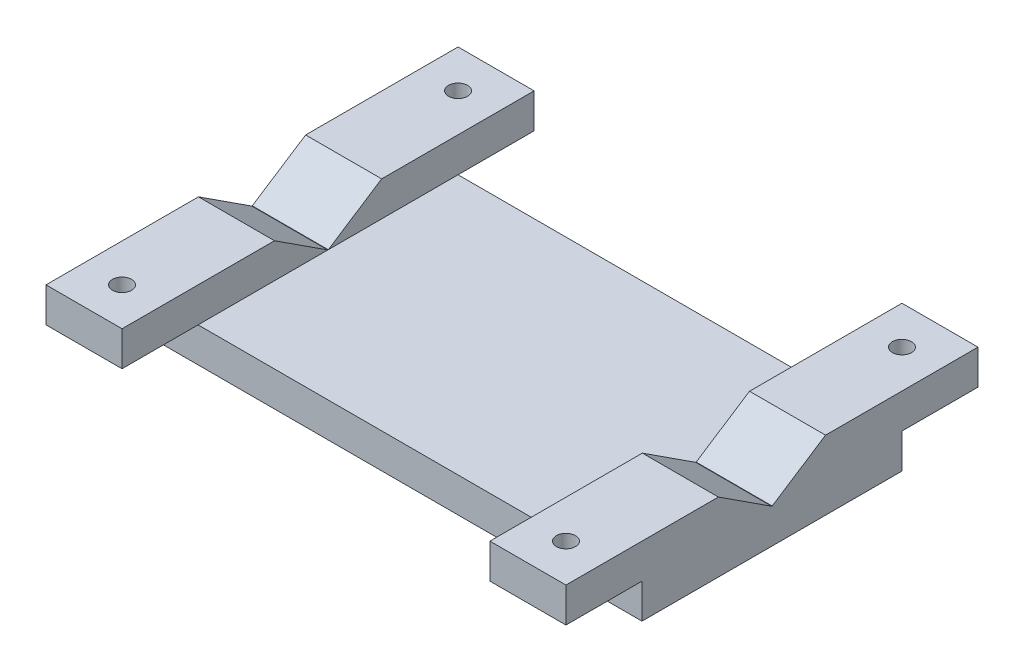
ISO-10303-21;
HEADER;
FILE_DESCRIPTION(('STEP AP214'),'2;1');
FILE_NAME('part.step','',(''),(''),'','','');
FILE_SCHEMA(('AUTOMOTIVE_DESIGN { 1 0 10303 214 1 1 1 1 }'));
ENDSEC;
DATA;
#1=APPLICATION_CONTEXT('core data for automotive mechanical design processes');
#2=APPLICATION_PROTOCOL_DEFINITION('international standard','automotive_design',2000,#1);
#3=PRODUCT_CONTEXT('',#1,'mechanical');
#4=PRODUCT('Part','Part','',(#3));
#5=PRODUCT_RELATED_PRODUCT_CATEGORY('part','',(#4));
#6=PRODUCT_DEFINITION_FORMATION('','',#4);
#7=PRODUCT_DEFINITION_CONTEXT('part definition',#1,'design');
#8=PRODUCT_DEFINITION('design','',#6,#7);
#9=PRODUCT_DEFINITION_SHAPE('','',#8);
#10=(LENGTH_UNIT() NAMED_UNIT(*) SI_UNIT(.MILLI.,.METRE.));
#11=(NAMED_UNIT(*) PLANE_ANGLE_UNIT() SI_UNIT($,.RADIAN.));
#12=(NAMED_UNIT(*) SI_UNIT($,.STERADIAN.) SOLID_ANGLE_UNIT());
#13=UNCERTAINTY_MEASURE_WITH_UNIT(LENGTH_MEASURE(1.E-05),#10,'distance_accuracy_value','');
#14=(GEOMETRIC_REPRESENTATION_CONTEXT(3) GLOBAL_UNCERTAINTY_ASSIGNED_CONTEXT((#13)) GLOBAL_UNIT_ASSIGNED_CONTEXT((#10,
#11,#12)) REPRESENTATION_CONTEXT('',''));
#15=CARTESIAN_POINT('',(0.,0.,0.));
#16=DIRECTION('',(0.,0.,1.));
#17=DIRECTION('',(1.,0.,0.));
#18=AXIS2_PLACEMENT_3D('',#15,#16,#17);
#19=CARTESIAN_POINT('',(0.,4.,0.));
#20=DIRECTION('',(0.,1.,0.));
#21=DIRECTION('',(0.,0.,1.));
#22=AXIS2_PLACEMENT_3D('',#19,#20,#21);
#23=PLANE('',#22);
#24=DIRECTION('',(0.,0.,-1.));
#25=VECTOR('',#24,1.);
#26=CARTESIAN_POINT('',(30.,4.,15.));
#27=LINE('',#26,#25);
#28=CARTESIAN_POINT('',(30.,4.,0.0247999999999568));
#29=VERTEX_POINT('',#28);
#30=CARTESIAN_POINT('',(30.,4.,-0.0247999999999568));
#31=VERTEX_POINT('',#30);
#32=EDGE_CURVE('E380',#29,#31,#27,.T.);
#33=ORIENTED_EDGE('',*,*,#32,.T.);
#34=DIRECTION('',(-1.,0.,0.));
#35=VECTOR('',#34,1.);
#36=CARTESIAN_POINT('',(0.,4.,-0.024799999999954));
#37=LINE('',#36,#35);
#38=CARTESIAN_POINT('',(21.2248,4.,-0.0247999999999568));
#39=VERTEX_POINT('',#38);
#40=EDGE_CURVE('E323',#31,#39,#37,.T.);
#41=ORIENTED_EDGE('',*,*,#40,.T.);
#42=DIRECTION('',(0.,0.,1.));
#43=VECTOR('',#42,1.);
#44=CARTESIAN_POINT('',(21.2248,4.,-23.7752));
#45=LINE('',#44,#43);
#46=CARTESIAN_POINT('',(21.2248,4.,-15.));
#47=VERTEX_POINT('',#46);
#48=EDGE_CURVE('E439',#47,#39,#45,.T.);
#49=ORIENTED_EDGE('',*,*,#48,.F.);
#50=DIRECTION('',(-1.,0.,0.));
#51=VECTOR('',#50,1.);
#52=CARTESIAN_POINT('',(30.,4.,-15.));
#53=LINE('',#52,#51);
#54=CARTESIAN_POINT('',(-21.2248,4.,-15.));
#55=VERTEX_POINT('',#54);
#56=EDGE_CURVE('E400',#47,#55,#53,.T.);
#57=ORIENTED_EDGE('',*,*,#56,.T.);
#58=DIRECTION('',(0.,0.,-1.));
#59=VECTOR('',#58,1.);
#60=CARTESIAN_POINT('',(-21.2248,4.,-23.7752));
#61=LINE('',#60,#59);
#62=CARTESIAN_POINT('',(-21.2248,4.,-0.0247999999999628));
#63=VERTEX_POINT('',#62);
#64=EDGE_CURVE('E292',#63,#55,#61,.T.);
#65=ORIENTED_EDGE('',*,*,#64,.F.);
#66=DIRECTION('',(-1.,0.,0.));
#67=VECTOR('',#66,1.);
#68=CARTESIAN_POINT('',(0.,4.,-0.0247999999999607));
#69=LINE('',#68,#67);
#70=CARTESIAN_POINT('',(-30.,4.,-0.0247999999999637));
#71=VERTEX_POINT('',#70);
#72=EDGE_CURVE('E314',#63,#71,#69,.T.);
#73=ORIENTED_EDGE('',*,*,#72,.T.);
#74=DIRECTION('',(0.,0.,1.));
#75=VECTOR('',#74,1.);
#76=CARTESIAN_POINT('',(-30.,4.,15.));
#77=LINE('',#76,#75);
#78=CARTESIAN_POINT('',(-30.,4.,0.0247999999999568));
#79=VERTEX_POINT('',#78);
#80=EDGE_CURVE('E306',#71,#79,#77,.T.);
#81=ORIENTED_EDGE('',*,*,#80,.T.);
#82=DIRECTION('',(1.,0.,0.));
#83=VECTOR('',#82,1.);
#84=CARTESIAN_POINT('',(0.,4.,0.0247999999999546));
#85=LINE('',#84,#83);
#86=CARTESIAN_POINT('',(-21.2248,4.,0.0247999999999567));
#87=VERTEX_POINT('',#86);
#88=EDGE_CURVE('E317',#79,#87,#85,.T.);
#89=ORIENTED_EDGE('',*,*,#88,.T.);
#90=DIRECTION('',(0.,0.,1.));
#91=VECTOR('',#90,1.);
#92=CARTESIAN_POINT('',(-21.2248,4.,0.));
#93=LINE('',#92,#91);
#94=CARTESIAN_POINT('',(-21.2248,4.,15.));
#95=VERTEX_POINT('',#94);
#96=EDGE_CURVE('E312',#87,#95,#93,.T.);
#97=ORIENTED_EDGE('',*,*,#96,.T.);
#98=DIRECTION('',(1.,0.,0.));
#99=VECTOR('',#98,1.);
#100=CARTESIAN_POINT('',(30.,4.,15.));
#101=LINE('',#100,#99);
#102=CARTESIAN_POINT('',(21.2248,4.,15.));
#103=VERTEX_POINT('',#102);
#104=EDGE_CURVE('E310',#95,#103,#101,.T.);
#105=ORIENTED_EDGE('',*,*,#104,.T.);
#106=DIRECTION('',(0.,0.,1.));
#107=VECTOR('',#106,1.);
#108=CARTESIAN_POINT('',(21.2248,4.,23.7752));
#109=LINE('',#108,#107);
#110=CARTESIAN_POINT('',(21.2248,4.,0.0247999999999561));
#111=VERTEX_POINT('',#110);
#112=EDGE_CURVE('E236',#111,#103,#109,.T.);
#113=ORIENTED_EDGE('',*,*,#112,.F.);
#114=DIRECTION('',(1.,0.,0.));
#115=VECTOR('',#114,1.);
#116=CARTESIAN_POINT('',(0.,4.,0.024799999999954));
#117=LINE('',#116,#115);
#118=EDGE_CURVE('E320',#111,#29,#117,.T.);
#119=ORIENTED_EDGE('',*,*,#118,.T.);
#120=EDGE_LOOP('',(#33,#41,#49,#57,#65,#73,#81,#89,#97,#105,#113,#119));
#121=FACE_BOUND('',#120,.T.);
#122=ADVANCED_FACE('F33',(#121),#23,.T.);
#123=CARTESIAN_POINT('',(-30.,4.,15.));
#124=DIRECTION('',(1.,0.,0.));
#125=DIRECTION('',(0.,0.,-1.));
#126=AXIS2_PLACEMENT_3D('',#123,#124,#125);
#127=PLANE('',#126);
#128=DIRECTION('',(0.,0.,1.));
#129=VECTOR('',#128,1.);
#130=CARTESIAN_POINT('',(-30.,0.,15.));
#131=LINE('',#130,#129);
#132=CARTESIAN_POINT('',(-30.,0.,-15.));
#133=VERTEX_POINT('',#132);
#134=CARTESIAN_POINT('',(-30.,0.,15.));
#135=VERTEX_POINT('',#134);
#136=EDGE_CURVE('E388',#133,#135,#131,.T.);
#137=ORIENTED_EDGE('',*,*,#136,.T.);
#138=DIRECTION('',(0.,-1.,0.));
#139=VECTOR('',#138,1.);
#140=CARTESIAN_POINT('',(-30.,4.,15.));
#141=LINE('',#140,#139);
#142=CARTESIAN_POINT('',(-30.,4.,15.));
#143=VERTEX_POINT('',#142);
#144=EDGE_CURVE('E369',#143,#135,#141,.T.);
#145=ORIENTED_EDGE('',*,*,#144,.F.);
#146=DIRECTION('',(0.,0.,1.));
#147=VECTOR('',#146,1.);
#148=CARTESIAN_POINT('',(-30.,4.,23.7752));
#149=LINE('',#148,#147);
#150=CARTESIAN_POINT('',(-30.,4.,23.7752));
#151=VERTEX_POINT('',#150);
#152=EDGE_CURVE('E261',#143,#151,#149,.T.);
#153=ORIENTED_EDGE('',*,*,#152,.T.);
#154=DIRECTION('',(0.,-1.,0.));
#155=VECTOR('',#154,1.);
#156=CARTESIAN_POINT('',(-30.,8.,23.7752));
#157=LINE('',#156,#155);
#158=CARTESIAN_POINT('',(-30.,8.,23.7752));
#159=VERTEX_POINT('',#158);
#160=EDGE_CURVE('E265',#159,#151,#157,.T.);
#161=ORIENTED_EDGE('',*,*,#160,.F.);
#162=DIRECTION('',(0.,0.,1.));
#163=VECTOR('',#162,1.);
#164=CARTESIAN_POINT('',(-30.,8.,23.7752));
#165=LINE('',#164,#163);
#166=CARTESIAN_POINT('',(-30.,8.,6.18425985525821));
#167=VERTEX_POINT('',#166);
#168=EDGE_CURVE('E263',#167,#159,#165,.T.);
#169=ORIENTED_EDGE('',*,*,#168,.F.);
#170=DIRECTION('',(0.,-0.544639035015032,-0.838670567945421));
#171=VECTOR('',#170,1.);
#172=CARTESIAN_POINT('',(-30.,10.8402629686448,10.5578812886943));
#173=LINE('',#172,#171);
#174=EDGE_CURVE('E340',#167,#79,#173,.T.);
#175=ORIENTED_EDGE('',*,*,#174,.T.);
#176=ORIENTED_EDGE('',*,*,#80,.F.);
#177=DIRECTION('',(0.,0.544639035015032,-0.838670567945421));
#178=VECTOR('',#177,1.);
#179=CARTESIAN_POINT('',(-30.,-2.8629188959943,10.5431683574426));
#180=LINE('',#179,#178);
#181=CARTESIAN_POINT('',(-30.,8.,-6.18425985525821));
#182=VERTEX_POINT('',#181);
#183=EDGE_CURVE('E11',#71,#182,#180,.T.);
#184=ORIENTED_EDGE('',*,*,#183,.T.);
#185=DIRECTION('',(0.,0.,1.));
#186=VECTOR('',#185,1.);
#187=CARTESIAN_POINT('',(-30.,8.,-23.7752));
#188=LINE('',#187,#186);
#189=CARTESIAN_POINT('',(-30.,8.,-23.7752));
#190=VERTEX_POINT('',#189);
#191=EDGE_CURVE('E48',#190,#182,#188,.T.);
#192=ORIENTED_EDGE('',*,*,#191,.F.);
#193=DIRECTION('',(0.,-1.,0.));
#194=VECTOR('',#193,1.);
#195=CARTESIAN_POINT('',(-30.,8.,-23.7752));
#196=LINE('',#195,#194);
#197=CARTESIAN_POINT('',(-30.,4.,-23.7752));
#198=VERTEX_POINT('',#197);
#199=EDGE_CURVE('E289',#190,#198,#196,.T.);
#200=ORIENTED_EDGE('',*,*,#199,.T.);
#201=DIRECTION('',(0.,0.,1.));
#202=VECTOR('',#201,1.);
#203=CARTESIAN_POINT('',(-30.,4.,-23.7752));
#204=LINE('',#203,#202);
#205=CARTESIAN_POINT('',(-30.,4.,-15.));
#206=VERTEX_POINT('',#205);
#207=EDGE_CURVE('E281',#198,#206,#204,.T.);
#208=ORIENTED_EDGE('',*,*,#207,.T.);
#209=DIRECTION('',(0.,-1.,0.));
#210=VECTOR('',#209,1.);
#211=CARTESIAN_POINT('',(-30.,4.,-15.));
#212=LINE('',#211,#210);
#213=EDGE_CURVE('E401',#206,#133,#212,.T.);
#214=ORIENTED_EDGE('',*,*,#213,.T.);
#215=EDGE_LOOP('',(#137,#145,#153,#161,#169,#175,#176,#184,#192,#200,#208,#214));
#216=FACE_BOUND('',#215,.T.);
#217=ADVANCED_FACE('F358',(#216),#127,.F.);
#218=CARTESIAN_POINT('',(30.,4.,15.));
#219=DIRECTION('',(0.,0.,-1.));
#220=DIRECTION('',(-1.,0.,0.));
#221=AXIS2_PLACEMENT_3D('',#218,#219,#220);
#222=PLANE('',#221);
#223=DIRECTION('',(1.,0.,0.));
#224=VECTOR('',#223,1.);
#225=CARTESIAN_POINT('',(30.,0.,15.));
#226=LINE('',#225,#224);
#227=CARTESIAN_POINT('',(30.,0.,15.));
#228=VERTEX_POINT('',#227);
#229=EDGE_CURVE('E407',#135,#228,#226,.T.);
#230=ORIENTED_EDGE('',*,*,#229,.T.);
#231=DIRECTION('',(0.,-1.,0.));
#232=VECTOR('',#231,1.);
#233=CARTESIAN_POINT('',(30.,4.,15.));
#234=LINE('',#233,#232);
#235=CARTESIAN_POINT('',(30.,4.,15.));
#236=VERTEX_POINT('',#235);
#237=EDGE_CURVE('E389',#236,#228,#234,.T.);
#238=ORIENTED_EDGE('',*,*,#237,.F.);
#239=DIRECTION('',(-1.,0.,0.));
#240=VECTOR('',#239,1.);
#241=CARTESIAN_POINT('',(30.,4.,15.));
#242=LINE('',#241,#240);
#243=EDGE_CURVE('E248',#236,#103,#242,.T.);
#244=ORIENTED_EDGE('',*,*,#243,.T.);
#245=ORIENTED_EDGE('',*,*,#104,.F.);
#246=EDGE_CURVE('E303',#143,#95,#101,.T.);
#247=ORIENTED_EDGE('',*,*,#246,.F.);
#248=ORIENTED_EDGE('',*,*,#144,.T.);
#249=EDGE_LOOP('',(#230,#238,#244,#245,#247,#248));
#250=FACE_BOUND('',#249,.T.);
#251=ADVANCED_FACE('F373',(#250),#222,.F.);
#252=CARTESIAN_POINT('',(30.,4.,15.));
#253=DIRECTION('',(-1.,0.,0.));
#254=DIRECTION('',(0.,0.,1.));
#255=AXIS2_PLACEMENT_3D('',#252,#253,#254);
#256=PLANE('',#255);
#257=DIRECTION('',(0.,0.,-1.));
#258=VECTOR('',#257,1.);
#259=CARTESIAN_POINT('',(30.,0.,15.));
#260=LINE('',#259,#258);
#261=CARTESIAN_POINT('',(30.,0.,-15.));
#262=VERTEX_POINT('',#261);
#263=EDGE_CURVE('E409',#228,#262,#260,.T.);
#264=ORIENTED_EDGE('',*,*,#263,.T.);
#265=DIRECTION('',(0.,-1.,0.));
#266=VECTOR('',#265,1.);
#267=CARTESIAN_POINT('',(30.,4.,-15.));
#268=LINE('',#267,#266);
#269=CARTESIAN_POINT('',(30.,4.,-15.));
#270=VERTEX_POINT('',#269);
#271=EDGE_CURVE('E392',#270,#262,#268,.T.);
#272=ORIENTED_EDGE('',*,*,#271,.F.);
#273=DIRECTION('',(0.,0.,-1.));
#274=VECTOR('',#273,1.);
#275=CARTESIAN_POINT('',(30.,4.,-23.7752));
#276=LINE('',#275,#274);
#277=CARTESIAN_POINT('',(30.,4.,-23.7752));
#278=VERTEX_POINT('',#277);
#279=EDGE_CURVE('E213',#270,#278,#276,.T.);
#280=ORIENTED_EDGE('',*,*,#279,.T.);
#281=DIRECTION('',(0.,-1.,0.));
#282=VECTOR('',#281,1.);
#283=CARTESIAN_POINT('',(30.,8.,-23.7752));
#284=LINE('',#283,#282);
#285=CARTESIAN_POINT('',(30.,8.,-23.7752));
#286=VERTEX_POINT('',#285);
#287=EDGE_CURVE('E219',#286,#278,#284,.T.);
#288=ORIENTED_EDGE('',*,*,#287,.F.);
#289=DIRECTION('',(0.,0.,-1.));
#290=VECTOR('',#289,1.);
#291=CARTESIAN_POINT('',(30.,8.,-23.7752));
#292=LINE('',#291,#290);
#293=CARTESIAN_POINT('',(30.,8.,-6.18425985525821));
#294=VERTEX_POINT('',#293);
#295=EDGE_CURVE('E204',#294,#286,#292,.T.);
#296=ORIENTED_EDGE('',*,*,#295,.F.);
#297=DIRECTION('',(0.,-0.544639035015032,0.838670567945421));
#298=VECTOR('',#297,1.);
#299=CARTESIAN_POINT('',(30.,-2.86291889599429,10.5431683574426));
#300=LINE('',#299,#298);
#301=EDGE_CURVE('E328',#294,#31,#300,.T.);
#302=ORIENTED_EDGE('',*,*,#301,.T.);
#303=ORIENTED_EDGE('',*,*,#32,.F.);
#304=DIRECTION('',(0.,0.544639035015032,0.838670567945421));
#305=VECTOR('',#304,1.);
#306=CARTESIAN_POINT('',(30.,10.8402629686448,10.5578812886943));
#307=LINE('',#306,#305);
#308=CARTESIAN_POINT('',(30.,8.,6.18425985525821));
#309=VERTEX_POINT('',#308);
#310=EDGE_CURVE('E335',#29,#309,#307,.T.);
#311=ORIENTED_EDGE('',*,*,#310,.T.);
#312=DIRECTION('',(0.,0.,-1.));
#313=VECTOR('',#312,1.);
#314=CARTESIAN_POINT('',(30.,8.,23.7752));
#315=LINE('',#314,#313);
#316=CARTESIAN_POINT('',(30.,8.,23.7752));
#317=VERTEX_POINT('',#316);
#318=EDGE_CURVE('E73',#317,#309,#315,.T.);
#319=ORIENTED_EDGE('',*,*,#318,.F.);
#320=DIRECTION('',(0.,-1.,0.));
#321=VECTOR('',#320,1.);
#322=CARTESIAN_POINT('',(30.,8.,23.7752));
#323=LINE('',#322,#321);
#324=CARTESIAN_POINT('',(30.,4.,23.7752));
#325=VERTEX_POINT('',#324);
#326=EDGE_CURVE('E235',#317,#325,#323,.T.);
#327=ORIENTED_EDGE('',*,*,#326,.T.);
#328=DIRECTION('',(0.,0.,-1.));
#329=VECTOR('',#328,1.);
#330=CARTESIAN_POINT('',(30.,4.,23.7752));
#331=LINE('',#330,#329);
#332=EDGE_CURVE('E232',#325,#236,#331,.T.);
#333=ORIENTED_EDGE('',*,*,#332,.T.);
#334=ORIENTED_EDGE('',*,*,#237,.T.);
#335=EDGE_LOOP('',(#264,#272,#280,#288,#296,#302,#303,#311,#319,#327,#333,#334));
#336=FACE_BOUND('',#335,.T.);
#337=ADVANCED_FACE('F422',(#336),#256,.F.);
#338=CARTESIAN_POINT('',(30.,4.,-15.));
#339=DIRECTION('',(0.,0.,1.));
#340=DIRECTION('',(1.,0.,0.));
#341=AXIS2_PLACEMENT_3D('',#338,#339,#340);
#342=PLANE('',#341);
#343=DIRECTION('',(-1.,0.,0.));
#344=VECTOR('',#343,1.);
#345=CARTESIAN_POINT('',(30.,0.,-15.));
#346=LINE('',#345,#344);
#347=EDGE_CURVE('E311',#262,#133,#346,.T.);
#348=ORIENTED_EDGE('',*,*,#347,.T.);
#349=ORIENTED_EDGE('',*,*,#213,.F.);
#350=EDGE_CURVE('E396',#55,#206,#53,.T.);
#351=ORIENTED_EDGE('',*,*,#350,.F.);
#352=ORIENTED_EDGE('',*,*,#56,.F.);
#353=EDGE_CURVE('E402',#270,#47,#53,.T.);
#354=ORIENTED_EDGE('',*,*,#353,.F.);
#355=ORIENTED_EDGE('',*,*,#271,.T.);
#356=EDGE_LOOP('',(#348,#349,#351,#352,#354,#355));
#357=FACE_BOUND('',#356,.T.);
#358=ADVANCED_FACE('F482',(#357),#342,.F.);
#359=CARTESIAN_POINT('',(0.,0.,0.));
#360=DIRECTION('',(0.,1.,0.));
#361=DIRECTION('',(0.,0.,1.));
#362=AXIS2_PLACEMENT_3D('',#359,#360,#361);
#363=PLANE('',#362);
#364=ORIENTED_EDGE('',*,*,#136,.F.);
#365=ORIENTED_EDGE('',*,*,#347,.F.);
#366=ORIENTED_EDGE('',*,*,#263,.F.);
#367=ORIENTED_EDGE('',*,*,#229,.F.);
#368=EDGE_LOOP('',(#364,#365,#366,#367));
#369=FACE_BOUND('',#368,.T.);
#370=ADVANCED_FACE('F419',(#369),#363,.F.);
#371=CARTESIAN_POINT('',(0.,8.,0.));
#372=DIRECTION('',(0.,-1.,0.));
#373=DIRECTION('',(0.,0.,-1.));
#374=AXIS2_PLACEMENT_3D('',#371,#372,#373);
#375=PLANE('',#374);
#376=ORIENTED_EDGE('',*,*,#191,.T.);
#377=DIRECTION('',(1.,0.,0.));
#378=VECTOR('',#377,1.);
#379=CARTESIAN_POINT('',(0.,8.,-6.18425985525821));
#380=LINE('',#379,#378);
#381=CARTESIAN_POINT('',(-21.2248,8.,-6.18425985525821));
#382=VERTEX_POINT('',#381);
#383=EDGE_CURVE('E345',#182,#382,#380,.T.);
#384=ORIENTED_EDGE('',*,*,#383,.T.);
#385=DIRECTION('',(0.,0.,-1.));
#386=VECTOR('',#385,1.);
#387=CARTESIAN_POINT('',(-21.2248,8.,-23.7752));
#388=LINE('',#387,#386);
#389=CARTESIAN_POINT('',(-21.2248,8.,-23.7752));
#390=VERTEX_POINT('',#389);
#391=EDGE_CURVE('E56',#382,#390,#388,.T.);
#392=ORIENTED_EDGE('',*,*,#391,.T.);
#393=DIRECTION('',(-1.,0.,0.));
#394=VECTOR('',#393,1.);
#395=CARTESIAN_POINT('',(-21.2248,8.,-23.7752));
#396=LINE('',#395,#394);
#397=EDGE_CURVE('E287',#390,#190,#396,.T.);
#398=ORIENTED_EDGE('',*,*,#397,.T.);
#399=EDGE_LOOP('',(#376,#384,#392,#398));
#400=FACE_BOUND('',#399,.T.);
#401=CARTESIAN_POINT('',(-25.6124,8.,-19.3876));
#402=DIRECTION('',(0.,1.,0.));
#403=DIRECTION('',(0.,0.,1.));
#404=AXIS2_PLACEMENT_3D('',#401,#402,#403);
#405=CIRCLE('',#404,1.1);
#406=CARTESIAN_POINT('',(-25.6124,8.,-18.2876));
#407=VERTEX_POINT('',#406);
#408=EDGE_CURVE('E278',#407,#407,#405,.T.);
#409=ORIENTED_EDGE('',*,*,#408,.F.);
#410=EDGE_LOOP('',(#409));
#411=FACE_BOUND('',#410,.T.);
#412=ADVANCED_FACE('F481',(#400,#411),#375,.F.);
#413=CARTESIAN_POINT('',(0.,4.,0.));
#414=DIRECTION('',(0.,-1.,0.));
#415=DIRECTION('',(0.,0.,-1.));
#416=AXIS2_PLACEMENT_3D('',#413,#414,#415);
#417=PLANE('',#416);
#418=CARTESIAN_POINT('',(-21.2248,4.,-23.7752));
#419=VERTEX_POINT('',#418);
#420=EDGE_CURVE('E298',#55,#419,#61,.T.);
#421=ORIENTED_EDGE('',*,*,#420,.F.);
#422=ORIENTED_EDGE('',*,*,#350,.T.);
#423=ORIENTED_EDGE('',*,*,#207,.F.);
#424=DIRECTION('',(-1.,0.,0.));
#425=VECTOR('',#424,1.);
#426=CARTESIAN_POINT('',(-21.2248,4.,-23.7752));
#427=LINE('',#426,#425);
#428=EDGE_CURVE('E285',#419,#198,#427,.T.);
#429=ORIENTED_EDGE('',*,*,#428,.F.);
#430=EDGE_LOOP('',(#421,#422,#423,#429));
#431=FACE_BOUND('',#430,.T.);
#432=CARTESIAN_POINT('',(-25.6124,4.,-19.3876));
#433=DIRECTION('',(0.,1.,0.));
#434=DIRECTION('',(0.,0.,1.));
#435=AXIS2_PLACEMENT_3D('',#432,#433,#434);
#436=CIRCLE('',#435,1.1);
#437=CARTESIAN_POINT('',(-25.6124,4.,-18.2876));
#438=VERTEX_POINT('',#437);
#439=EDGE_CURVE('E277',#438,#438,#436,.T.);
#440=ORIENTED_EDGE('',*,*,#439,.T.);
#441=EDGE_LOOP('',(#440));
#442=FACE_BOUND('',#441,.T.);
#443=ADVANCED_FACE('F588',(#431,#442),#417,.T.);
#444=CARTESIAN_POINT('',(-21.2248,8.,-23.7752));
#445=DIRECTION('',(-1.,0.,0.));
#446=DIRECTION('',(0.,0.,1.));
#447=AXIS2_PLACEMENT_3D('',#444,#445,#446);
#448=PLANE('',#447);
#449=ORIENTED_EDGE('',*,*,#64,.T.);
#450=ORIENTED_EDGE('',*,*,#420,.T.);
#451=DIRECTION('',(0.,-1.,0.));
#452=VECTOR('',#451,1.);
#453=CARTESIAN_POINT('',(-21.2248,8.,-23.7752));
#454=LINE('',#453,#452);
#455=EDGE_CURVE('E299',#390,#419,#454,.T.);
#456=ORIENTED_EDGE('',*,*,#455,.F.);
#457=ORIENTED_EDGE('',*,*,#391,.F.);
#458=DIRECTION('',(0.,-0.544639035015032,0.838670567945421));
#459=VECTOR('',#458,1.);
#460=CARTESIAN_POINT('',(-21.2248,16.0350617324459,-18.5571698991388));
#461=LINE('',#460,#459);
#462=EDGE_CURVE('E41',#382,#63,#461,.T.);
#463=ORIENTED_EDGE('',*,*,#462,.T.);
#464=EDGE_LOOP('',(#449,#450,#456,#457,#463));
#465=FACE_BOUND('',#464,.T.);
#466=ADVANCED_FACE('F349',(#465),#448,.F.);
#467=CARTESIAN_POINT('',(-21.2248,8.,-23.7752));
#468=DIRECTION('',(0.,0.,1.));
#469=DIRECTION('',(1.,0.,0.));
#470=AXIS2_PLACEMENT_3D('',#467,#468,#469);
#471=PLANE('',#470);
#472=ORIENTED_EDGE('',*,*,#428,.T.);
#473=ORIENTED_EDGE('',*,*,#199,.F.);
#474=ORIENTED_EDGE('',*,*,#397,.F.);
#475=ORIENTED_EDGE('',*,*,#455,.T.);
#476=EDGE_LOOP('',(#472,#473,#474,#475));
#477=FACE_BOUND('',#476,.T.);
#478=ADVANCED_FACE('F587',(#477),#471,.F.);
#479=CARTESIAN_POINT('',(-25.6124,8.,-19.3876));
#480=DIRECTION('',(0.,-1.,0.));
#481=DIRECTION('',(0.,0.,-1.));
#482=AXIS2_PLACEMENT_3D('',#479,#480,#481);
#483=CYLINDRICAL_SURFACE('',#482,1.1);
#484=ORIENTED_EDGE('',*,*,#408,.T.);
#485=EDGE_LOOP('',(#484));
#486=FACE_BOUND('',#485,.T.);
#487=ORIENTED_EDGE('',*,*,#439,.F.);
#488=EDGE_LOOP('',(#487));
#489=FACE_BOUND('',#488,.T.);
#490=ADVANCED_FACE('F656',(#486,#489),#483,.F.);
#491=CARTESIAN_POINT('',(0.,4.,0.));
#492=DIRECTION('',(0.,-1.,0.));
#493=DIRECTION('',(0.,0.,-1.));
#494=AXIS2_PLACEMENT_3D('',#491,#492,#493);
#495=PLANE('',#494);
#496=CARTESIAN_POINT('',(-25.6124,4.,19.3876));
#497=DIRECTION('',(0.,1.,0.));
#498=DIRECTION('',(0.,0.,-1.));
#499=AXIS2_PLACEMENT_3D('',#496,#497,#498);
#500=CIRCLE('',#499,1.1);
#501=CARTESIAN_POINT('',(-25.6124,4.,18.2876));
#502=VERTEX_POINT('',#501);
#503=EDGE_CURVE('E250',#502,#502,#500,.T.);
#504=ORIENTED_EDGE('',*,*,#503,.T.);
#505=EDGE_LOOP('',(#504));
#506=FACE_BOUND('',#505,.T.);
#507=ORIENTED_EDGE('',*,*,#246,.T.);
#508=DIRECTION('',(0.,0.,-1.));
#509=VECTOR('',#508,1.);
#510=CARTESIAN_POINT('',(-21.2248,4.,23.7752));
#511=LINE('',#510,#509);
#512=CARTESIAN_POINT('',(-21.2248,4.,23.7752));
#513=VERTEX_POINT('',#512);
#514=EDGE_CURVE('E268',#513,#95,#511,.T.);
#515=ORIENTED_EDGE('',*,*,#514,.F.);
#516=DIRECTION('',(1.,0.,0.));
#517=VECTOR('',#516,1.);
#518=CARTESIAN_POINT('',(-21.2248,4.,23.7752));
#519=LINE('',#518,#517);
#520=EDGE_CURVE('E254',#151,#513,#519,.T.);
#521=ORIENTED_EDGE('',*,*,#520,.F.);
#522=ORIENTED_EDGE('',*,*,#152,.F.);
#523=EDGE_LOOP('',(#507,#515,#521,#522));
#524=FACE_BOUND('',#523,.T.);
#525=ADVANCED_FACE('F378',(#506,#524),#495,.T.);
#526=CARTESIAN_POINT('',(0.,8.,0.));
#527=DIRECTION('',(0.,-1.,0.));
#528=DIRECTION('',(0.,0.,-1.));
#529=AXIS2_PLACEMENT_3D('',#526,#527,#528);
#530=PLANE('',#529);
#531=DIRECTION('',(1.,0.,0.));
#532=VECTOR('',#531,1.);
#533=CARTESIAN_POINT('',(-21.2248,8.,23.7752));
#534=LINE('',#533,#532);
#535=CARTESIAN_POINT('',(-21.2248,8.,23.7752));
#536=VERTEX_POINT('',#535);
#537=EDGE_CURVE('E257',#159,#536,#534,.T.);
#538=ORIENTED_EDGE('',*,*,#537,.T.);
#539=DIRECTION('',(0.,0.,-1.));
#540=VECTOR('',#539,1.);
#541=CARTESIAN_POINT('',(-21.2248,8.,23.7752));
#542=LINE('',#541,#540);
#543=CARTESIAN_POINT('',(-21.2248,8.,6.18425985525821));
#544=VERTEX_POINT('',#543);
#545=EDGE_CURVE('E260',#536,#544,#542,.T.);
#546=ORIENTED_EDGE('',*,*,#545,.T.);
#547=DIRECTION('',(-1.,0.,0.));
#548=VECTOR('',#547,1.);
#549=CARTESIAN_POINT('',(0.,8.,6.18425985525821));
#550=LINE('',#549,#548);
#551=EDGE_CURVE('E337',#544,#167,#550,.T.);
#552=ORIENTED_EDGE('',*,*,#551,.T.);
#553=ORIENTED_EDGE('',*,*,#168,.T.);
#554=EDGE_LOOP('',(#538,#546,#552,#553));
#555=FACE_BOUND('',#554,.T.);
#556=CARTESIAN_POINT('',(-25.6124,8.,19.3876));
#557=DIRECTION('',(0.,1.,0.));
#558=DIRECTION('',(0.,0.,-1.));
#559=AXIS2_PLACEMENT_3D('',#556,#557,#558);
#560=CIRCLE('',#559,1.1);
#561=CARTESIAN_POINT('',(-25.6124,8.,18.2876));
#562=VERTEX_POINT('',#561);
#563=EDGE_CURVE('E251',#562,#562,#560,.T.);
#564=ORIENTED_EDGE('',*,*,#563,.F.);
#565=EDGE_LOOP('',(#564));
#566=FACE_BOUND('',#565,.T.);
#567=ADVANCED_FACE('F571',(#555,#566),#530,.F.);
#568=CARTESIAN_POINT('',(-21.2248,8.,23.7752));
#569=DIRECTION('',(0.,0.,-1.));
#570=DIRECTION('',(-1.,0.,0.));
#571=AXIS2_PLACEMENT_3D('',#568,#569,#570);
#572=PLANE('',#571);
#573=ORIENTED_EDGE('',*,*,#520,.T.);
#574=DIRECTION('',(0.,-1.,0.));
#575=VECTOR('',#574,1.);
#576=CARTESIAN_POINT('',(-21.2248,8.,23.7752));
#577=LINE('',#576,#575);
#578=EDGE_CURVE('E274',#536,#513,#577,.T.);
#579=ORIENTED_EDGE('',*,*,#578,.F.);
#580=ORIENTED_EDGE('',*,*,#537,.F.);
#581=ORIENTED_EDGE('',*,*,#160,.T.);
#582=EDGE_LOOP('',(#573,#579,#580,#581));
#583=FACE_BOUND('',#582,.T.);
#584=ADVANCED_FACE('F385',(#583),#572,.F.);
#585=CARTESIAN_POINT('',(-21.2248,8.,23.7752));
#586=DIRECTION('',(-1.,0.,0.));
#587=DIRECTION('',(0.,0.,1.));
#588=AXIS2_PLACEMENT_3D('',#585,#586,#587);
#589=PLANE('',#588);
#590=ORIENTED_EDGE('',*,*,#514,.T.);
#591=ORIENTED_EDGE('',*,*,#96,.F.);
#592=DIRECTION('',(0.,0.544639035015032,0.838670567945421));
#593=VECTOR('',#592,1.);
#594=CARTESIAN_POINT('',(-21.2248,16.0350617324459,18.5571698991388));
#595=LINE('',#594,#593);
#596=EDGE_CURVE('E342',#87,#544,#595,.T.);
#597=ORIENTED_EDGE('',*,*,#596,.T.);
#598=ORIENTED_EDGE('',*,*,#545,.F.);
#599=ORIENTED_EDGE('',*,*,#578,.T.);
#600=EDGE_LOOP('',(#590,#591,#597,#598,#599));
#601=FACE_BOUND('',#600,.T.);
#602=ADVANCED_FACE('F381',(#601),#589,.F.);
#603=CARTESIAN_POINT('',(-25.6124,8.,19.3876));
#604=DIRECTION('',(0.,-1.,0.));
#605=DIRECTION('',(0.,0.,-1.));
#606=AXIS2_PLACEMENT_3D('',#603,#604,#605);
#607=CYLINDRICAL_SURFACE('',#606,1.1);
#608=ORIENTED_EDGE('',*,*,#563,.T.);
#609=EDGE_LOOP('',(#608));
#610=FACE_BOUND('',#609,.T.);
#611=ORIENTED_EDGE('',*,*,#503,.F.);
#612=EDGE_LOOP('',(#611));
#613=FACE_BOUND('',#612,.T.);
#614=ADVANCED_FACE('F562',(#610,#613),#607,.F.);
#615=CARTESIAN_POINT('',(0.,4.,0.));
#616=DIRECTION('',(0.,-1.,0.));
#617=DIRECTION('',(0.,0.,-1.));
#618=AXIS2_PLACEMENT_3D('',#615,#616,#617);
#619=PLANE('',#618);
#620=CARTESIAN_POINT('',(25.6124,4.,19.3875999999999));
#621=DIRECTION('',(0.,1.,0.));
#622=DIRECTION('',(0.,0.,1.));
#623=AXIS2_PLACEMENT_3D('',#620,#621,#622);
#624=CIRCLE('',#623,1.1);
#625=CARTESIAN_POINT('',(25.6124,4.,20.4876));
#626=VERTEX_POINT('',#625);
#627=EDGE_CURVE('E218',#626,#626,#624,.T.);
#628=ORIENTED_EDGE('',*,*,#627,.T.);
#629=EDGE_LOOP('',(#628));
#630=FACE_BOUND('',#629,.T.);
#631=ORIENTED_EDGE('',*,*,#243,.F.);
#632=ORIENTED_EDGE('',*,*,#332,.F.);
#633=DIRECTION('',(1.,0.,0.));
#634=VECTOR('',#633,1.);
#635=CARTESIAN_POINT('',(21.2248,4.,23.7752));
#636=LINE('',#635,#634);
#637=CARTESIAN_POINT('',(21.2248,4.,23.7752));
#638=VERTEX_POINT('',#637);
#639=EDGE_CURVE('E239',#638,#325,#636,.T.);
#640=ORIENTED_EDGE('',*,*,#639,.F.);
#641=EDGE_CURVE('E228',#103,#638,#109,.T.);
#642=ORIENTED_EDGE('',*,*,#641,.F.);
#643=EDGE_LOOP('',(#631,#632,#640,#642));
#644=FACE_BOUND('',#643,.T.);
#645=ADVANCED_FACE('F427',(#630,#644),#619,.T.);
#646=CARTESIAN_POINT('',(0.,8.,0.));
#647=DIRECTION('',(0.,-1.,0.));
#648=DIRECTION('',(0.,0.,-1.));
#649=AXIS2_PLACEMENT_3D('',#646,#647,#648);
#650=PLANE('',#649);
#651=DIRECTION('',(0.,0.,1.));
#652=VECTOR('',#651,1.);
#653=CARTESIAN_POINT('',(21.2248,8.,23.7752));
#654=LINE('',#653,#652);
#655=CARTESIAN_POINT('',(21.2248,8.,6.18425985525821));
#656=VERTEX_POINT('',#655);
#657=CARTESIAN_POINT('',(21.2248,8.,23.7752));
#658=VERTEX_POINT('',#657);
#659=EDGE_CURVE('E81',#656,#658,#654,.T.);
#660=ORIENTED_EDGE('',*,*,#659,.T.);
#661=DIRECTION('',(1.,0.,0.));
#662=VECTOR('',#661,1.);
#663=CARTESIAN_POINT('',(21.2248,8.,23.7752));
#664=LINE('',#663,#662);
#665=EDGE_CURVE('E231',#658,#317,#664,.T.);
#666=ORIENTED_EDGE('',*,*,#665,.T.);
#667=ORIENTED_EDGE('',*,*,#318,.T.);
#668=DIRECTION('',(-1.,0.,0.));
#669=VECTOR('',#668,1.);
#670=CARTESIAN_POINT('',(0.,8.,6.1842598552582));
#671=LINE('',#670,#669);
#672=EDGE_CURVE('E331',#309,#656,#671,.T.);
#673=ORIENTED_EDGE('',*,*,#672,.T.);
#674=EDGE_LOOP('',(#660,#666,#667,#673));
#675=FACE_BOUND('',#674,.T.);
#676=CARTESIAN_POINT('',(25.6124,8.,19.3875999999999));
#677=DIRECTION('',(0.,1.,0.));
#678=DIRECTION('',(0.,0.,1.));
#679=AXIS2_PLACEMENT_3D('',#676,#677,#678);
#680=CIRCLE('',#679,1.1);
#681=CARTESIAN_POINT('',(25.6124,8.,20.4876));
#682=VERTEX_POINT('',#681);
#683=EDGE_CURVE('E222',#682,#682,#680,.T.);
#684=ORIENTED_EDGE('',*,*,#683,.F.);
#685=EDGE_LOOP('',(#684));
#686=FACE_BOUND('',#685,.T.);
#687=ADVANCED_FACE('F541',(#675,#686),#650,.F.);
#688=CARTESIAN_POINT('',(21.2248,8.,23.7752));
#689=DIRECTION('',(1.,0.,0.));
#690=DIRECTION('',(0.,0.,-1.));
#691=AXIS2_PLACEMENT_3D('',#688,#689,#690);
#692=PLANE('',#691);
#693=ORIENTED_EDGE('',*,*,#112,.T.);
#694=ORIENTED_EDGE('',*,*,#641,.T.);
#695=DIRECTION('',(0.,-1.,0.));
#696=VECTOR('',#695,1.);
#697=CARTESIAN_POINT('',(21.2248,8.,23.7752));
#698=LINE('',#697,#696);
#699=EDGE_CURVE('E245',#658,#638,#698,.T.);
#700=ORIENTED_EDGE('',*,*,#699,.F.);
#701=ORIENTED_EDGE('',*,*,#659,.F.);
#702=DIRECTION('',(0.,-0.544639035015032,-0.838670567945421));
#703=VECTOR('',#702,1.);
#704=CARTESIAN_POINT('',(21.2248,16.0350617324459,18.5571698991388));
#705=LINE('',#704,#703);
#706=EDGE_CURVE('E333',#656,#111,#705,.T.);
#707=ORIENTED_EDGE('',*,*,#706,.T.);
#708=EDGE_LOOP('',(#693,#694,#700,#701,#707));
#709=FACE_BOUND('',#708,.T.);
#710=ADVANCED_FACE('F428',(#709),#692,.F.);
#711=CARTESIAN_POINT('',(21.2248,8.,23.7752));
#712=DIRECTION('',(0.,0.,-1.));
#713=DIRECTION('',(-1.,0.,0.));
#714=AXIS2_PLACEMENT_3D('',#711,#712,#713);
#715=PLANE('',#714);
#716=ORIENTED_EDGE('',*,*,#639,.T.);
#717=ORIENTED_EDGE('',*,*,#326,.F.);
#718=ORIENTED_EDGE('',*,*,#665,.F.);
#719=ORIENTED_EDGE('',*,*,#699,.T.);
#720=EDGE_LOOP('',(#716,#717,#718,#719));
#721=FACE_BOUND('',#720,.T.);
#722=ADVANCED_FACE('F540',(#721),#715,.F.);
#723=CARTESIAN_POINT('',(25.6124,8.,19.3875999999999));
#724=DIRECTION('',(0.,-1.,0.));
#725=DIRECTION('',(0.,0.,-1.));
#726=AXIS2_PLACEMENT_3D('',#723,#724,#725);
#727=CYLINDRICAL_SURFACE('',#726,1.1);
#728=ORIENTED_EDGE('',*,*,#683,.T.);
#729=EDGE_LOOP('',(#728));
#730=FACE_BOUND('',#729,.T.);
#731=ORIENTED_EDGE('',*,*,#627,.F.);
#732=EDGE_LOOP('',(#731));
#733=FACE_BOUND('',#732,.T.);
#734=ADVANCED_FACE('F464',(#730,#733),#727,.F.);
#735=CARTESIAN_POINT('',(0.,4.,0.));
#736=DIRECTION('',(0.,-1.,0.));
#737=DIRECTION('',(0.,0.,-1.));
#738=AXIS2_PLACEMENT_3D('',#735,#736,#737);
#739=PLANE('',#738);
#740=CARTESIAN_POINT('',(25.6124,4.,-19.3876));
#741=DIRECTION('',(0.,1.,0.));
#742=DIRECTION('',(0.,0.,-1.));
#743=AXIS2_PLACEMENT_3D('',#740,#741,#742);
#744=CIRCLE('',#743,1.1);
#745=CARTESIAN_POINT('',(25.6124,4.,-20.4876));
#746=VERTEX_POINT('',#745);
#747=EDGE_CURVE('E449',#746,#746,#744,.T.);
#748=ORIENTED_EDGE('',*,*,#747,.T.);
#749=EDGE_LOOP('',(#748));
#750=FACE_BOUND('',#749,.T.);
#751=ORIENTED_EDGE('',*,*,#353,.T.);
#752=CARTESIAN_POINT('',(21.2248,4.,-23.7752));
#753=VERTEX_POINT('',#752);
#754=EDGE_CURVE('E440',#753,#47,#45,.T.);
#755=ORIENTED_EDGE('',*,*,#754,.F.);
#756=DIRECTION('',(-1.,0.,0.));
#757=VECTOR('',#756,1.);
#758=CARTESIAN_POINT('',(21.2248,4.,-23.7752));
#759=LINE('',#758,#757);
#760=EDGE_CURVE('E217',#278,#753,#759,.T.);
#761=ORIENTED_EDGE('',*,*,#760,.F.);
#762=ORIENTED_EDGE('',*,*,#279,.F.);
#763=EDGE_LOOP('',(#751,#755,#761,#762));
#764=FACE_BOUND('',#763,.T.);
#765=ADVANCED_FACE('F444',(#750,#764),#739,.T.);
#766=CARTESIAN_POINT('',(0.,8.,0.));
#767=DIRECTION('',(0.,-1.,0.));
#768=DIRECTION('',(0.,0.,-1.));
#769=AXIS2_PLACEMENT_3D('',#766,#767,#768);
#770=PLANE('',#769);
#771=DIRECTION('',(-1.,0.,0.));
#772=VECTOR('',#771,1.);
#773=CARTESIAN_POINT('',(21.2248,8.,-23.7752));
#774=LINE('',#773,#772);
#775=CARTESIAN_POINT('',(21.2248,8.,-23.7752));
#776=VERTEX_POINT('',#775);
#777=EDGE_CURVE('E205',#286,#776,#774,.T.);
#778=ORIENTED_EDGE('',*,*,#777,.T.);
#779=DIRECTION('',(0.,0.,1.));
#780=VECTOR('',#779,1.);
#781=CARTESIAN_POINT('',(21.2248,8.,-23.7752));
#782=LINE('',#781,#780);
#783=CARTESIAN_POINT('',(21.2248,8.,-6.18425985525821));
#784=VERTEX_POINT('',#783);
#785=EDGE_CURVE('E192',#776,#784,#782,.T.);
#786=ORIENTED_EDGE('',*,*,#785,.T.);
#787=DIRECTION('',(1.,0.,0.));
#788=VECTOR('',#787,1.);
#789=CARTESIAN_POINT('',(0.,8.,-6.1842598552582));
#790=LINE('',#789,#788);
#791=EDGE_CURVE('E326',#784,#294,#790,.T.);
#792=ORIENTED_EDGE('',*,*,#791,.T.);
#793=ORIENTED_EDGE('',*,*,#295,.T.);
#794=EDGE_LOOP('',(#778,#786,#792,#793));
#795=FACE_BOUND('',#794,.T.);
#796=CARTESIAN_POINT('',(25.6124,8.,-19.3876));
#797=DIRECTION('',(0.,1.,0.));
#798=DIRECTION('',(0.,0.,-1.));
#799=AXIS2_PLACEMENT_3D('',#796,#797,#798);
#800=CIRCLE('',#799,1.1);
#801=CARTESIAN_POINT('',(25.6124,8.,-20.4876));
#802=VERTEX_POINT('',#801);
#803=EDGE_CURVE('E447',#802,#802,#800,.T.);
#804=ORIENTED_EDGE('',*,*,#803,.F.);
#805=EDGE_LOOP('',(#804));
#806=FACE_BOUND('',#805,.T.);
#807=ADVANCED_FACE('F208',(#795,#806),#770,.F.);
#808=CARTESIAN_POINT('',(21.2248,8.,-23.7752));
#809=DIRECTION('',(0.,0.,1.));
#810=DIRECTION('',(1.,0.,0.));
#811=AXIS2_PLACEMENT_3D('',#808,#809,#810);
#812=PLANE('',#811);
#813=ORIENTED_EDGE('',*,*,#760,.T.);
#814=DIRECTION('',(0.,-1.,0.));
#815=VECTOR('',#814,1.);
#816=CARTESIAN_POINT('',(21.2248,8.,-23.7752));
#817=LINE('',#816,#815);
#818=EDGE_CURVE('E197',#776,#753,#817,.T.);
#819=ORIENTED_EDGE('',*,*,#818,.F.);
#820=ORIENTED_EDGE('',*,*,#777,.F.);
#821=ORIENTED_EDGE('',*,*,#287,.T.);
#822=EDGE_LOOP('',(#813,#819,#820,#821));
#823=FACE_BOUND('',#822,.T.);
#824=ADVANCED_FACE('F215',(#823),#812,.F.);
#825=CARTESIAN_POINT('',(21.2248,8.,-23.7752));
#826=DIRECTION('',(1.,0.,0.));
#827=DIRECTION('',(0.,0.,-1.));
#828=AXIS2_PLACEMENT_3D('',#825,#826,#827);
#829=PLANE('',#828);
#830=ORIENTED_EDGE('',*,*,#754,.T.);
#831=ORIENTED_EDGE('',*,*,#48,.T.);
#832=DIRECTION('',(0.,0.544639035015032,-0.838670567945421));
#833=VECTOR('',#832,1.);
#834=CARTESIAN_POINT('',(21.2248,16.0350617324459,-18.5571698991388));
#835=LINE('',#834,#833);
#836=EDGE_CURVE('E200',#39,#784,#835,.T.);
#837=ORIENTED_EDGE('',*,*,#836,.T.);
#838=ORIENTED_EDGE('',*,*,#785,.F.);
#839=ORIENTED_EDGE('',*,*,#818,.T.);
#840=EDGE_LOOP('',(#830,#831,#837,#838,#839));
#841=FACE_BOUND('',#840,.T.);
#842=ADVANCED_FACE('F195',(#841),#829,.F.);
#843=CARTESIAN_POINT('',(25.6124,8.,-19.3876));
#844=DIRECTION('',(0.,-1.,0.));
#845=DIRECTION('',(0.,0.,-1.));
#846=AXIS2_PLACEMENT_3D('',#843,#844,#845);
#847=CYLINDRICAL_SURFACE('',#846,1.1);
#848=ORIENTED_EDGE('',*,*,#803,.T.);
#849=EDGE_LOOP('',(#848));
#850=FACE_BOUND('',#849,.T.);
#851=ORIENTED_EDGE('',*,*,#747,.F.);
#852=EDGE_LOOP('',(#851));
#853=FACE_BOUND('',#852,.T.);
#854=ADVANCED_FACE('F455',(#850,#853),#847,.F.);
#855=CARTESIAN_POINT('',(21.2248,8.02632707782464,-6.22479999999999));
#856=DIRECTION('',(0.,-0.838670567945421,-0.544639035015032));
#857=DIRECTION('',(1.,0.,0.));
#858=AXIS2_PLACEMENT_3D('',#855,#856,#857);
#859=PLANE('',#858);
#860=ORIENTED_EDGE('',*,*,#836,.F.);
#861=ORIENTED_EDGE('',*,*,#40,.F.);
#862=ORIENTED_EDGE('',*,*,#301,.F.);
#863=ORIENTED_EDGE('',*,*,#791,.F.);
#864=EDGE_LOOP('',(#860,#861,#862,#863));
#865=FACE_BOUND('',#864,.T.);
#866=ADVANCED_FACE('F437',(#865),#859,.F.);
#867=CARTESIAN_POINT('',(21.2248,8.02632707782464,6.22479999999999));
#868=DIRECTION('',(0.,-0.838670567945421,0.544639035015032));
#869=DIRECTION('',(-1.,0.,0.));
#870=AXIS2_PLACEMENT_3D('',#867,#868,#869);
#871=PLANE('',#870);
#872=ORIENTED_EDGE('',*,*,#310,.F.);
#873=ORIENTED_EDGE('',*,*,#118,.F.);
#874=ORIENTED_EDGE('',*,*,#706,.F.);
#875=ORIENTED_EDGE('',*,*,#672,.F.);
#876=EDGE_LOOP('',(#872,#873,#874,#875));
#877=FACE_BOUND('',#876,.T.);
#878=ADVANCED_FACE('F491',(#877),#871,.F.);
#879=CARTESIAN_POINT('',(-21.2248,8.02632707782464,6.22479999999999));
#880=DIRECTION('',(0.,-0.838670567945421,0.544639035015032));
#881=DIRECTION('',(-1.,0.,0.));
#882=AXIS2_PLACEMENT_3D('',#879,#880,#881);
#883=PLANE('',#882);
#884=ORIENTED_EDGE('',*,*,#596,.F.);
#885=ORIENTED_EDGE('',*,*,#88,.F.);
#886=ORIENTED_EDGE('',*,*,#174,.F.);
#887=ORIENTED_EDGE('',*,*,#551,.F.);
#888=EDGE_LOOP('',(#884,#885,#886,#887));
#889=FACE_BOUND('',#888,.T.);
#890=ADVANCED_FACE('F364',(#889),#883,.F.);
#891=CARTESIAN_POINT('',(-21.2248,8.02632707782464,-6.22479999999999));
#892=DIRECTION('',(0.,-0.838670567945421,-0.544639035015032));
#893=DIRECTION('',(1.,0.,0.));
#894=AXIS2_PLACEMENT_3D('',#891,#892,#893);
#895=PLANE('',#894);
#896=ORIENTED_EDGE('',*,*,#183,.F.);
#897=ORIENTED_EDGE('',*,*,#72,.F.);
#898=ORIENTED_EDGE('',*,*,#462,.F.);
#899=ORIENTED_EDGE('',*,*,#383,.F.);
#900=EDGE_LOOP('',(#896,#897,#898,#899));
#901=FACE_BOUND('',#900,.T.);
#902=ADVANCED_FACE('F35',(#901),#895,.F.);
#903=CLOSED_SHELL('',(#122,#217,#251,#337,#358,#370,#412,#443,#466,#478,#490,#525,#567,#584,
#602,#614,#645,#687,#710,#722,#734,#765,#807,#824,#842,#854,#866,#878,#890,#902));
#904=MANIFOLD_SOLID_BREP('B2',#903);
#905=ADVANCED_BREP_SHAPE_REPRESENTATION('',(#18,#904),#14);
#906=SHAPE_DEFINITION_REPRESENTATION(#9,#905);
ENDSEC;
END-ISO-10303-21;
